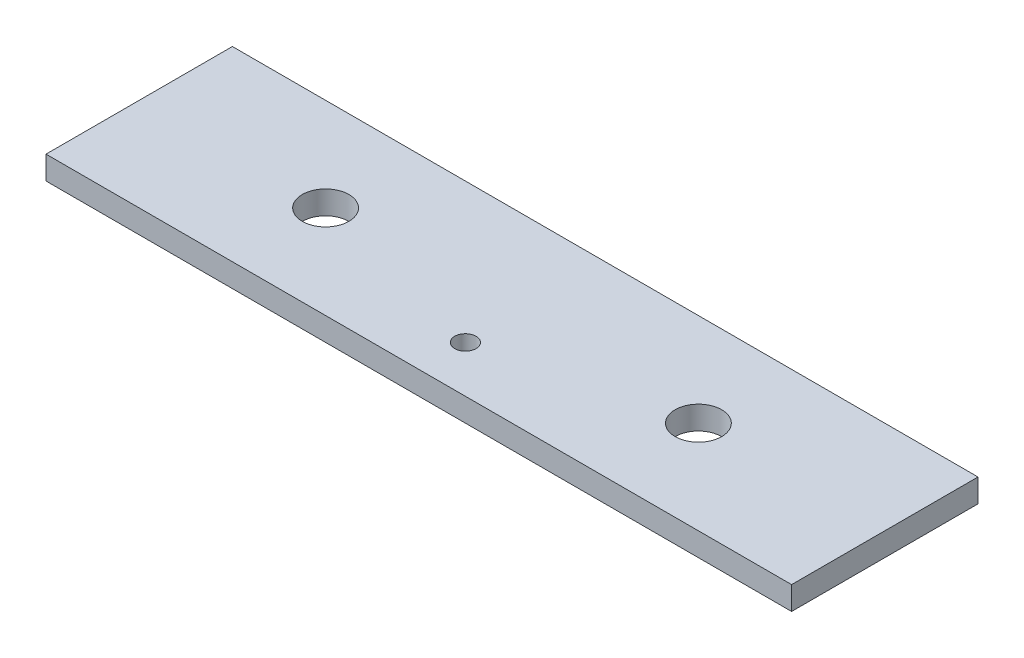
ISO-10303-21;
HEADER;
FILE_DESCRIPTION(('STEP AP214'),'2;1');
FILE_NAME('part.step','',(''),(''),'','','');
FILE_SCHEMA(('AUTOMOTIVE_DESIGN { 1 0 10303 214 1 1 1 1 }'));
ENDSEC;
DATA;
#1=APPLICATION_CONTEXT('core data for automotive mechanical design processes');
#2=APPLICATION_PROTOCOL_DEFINITION('international standard','automotive_design',2000,#1);
#3=PRODUCT_CONTEXT('',#1,'mechanical');
#4=PRODUCT('Part','Part','',(#3));
#5=PRODUCT_RELATED_PRODUCT_CATEGORY('part','',(#4));
#6=PRODUCT_DEFINITION_FORMATION('','',#4);
#7=PRODUCT_DEFINITION_CONTEXT('part definition',#1,'design');
#8=PRODUCT_DEFINITION('design','',#6,#7);
#9=PRODUCT_DEFINITION_SHAPE('','',#8);
#10=(LENGTH_UNIT() NAMED_UNIT(*) SI_UNIT(.MILLI.,.METRE.));
#11=(NAMED_UNIT(*) PLANE_ANGLE_UNIT() SI_UNIT($,.RADIAN.));
#12=(NAMED_UNIT(*) SI_UNIT($,.STERADIAN.) SOLID_ANGLE_UNIT());
#13=UNCERTAINTY_MEASURE_WITH_UNIT(LENGTH_MEASURE(1.E-05),#10,'distance_accuracy_value','');
#14=(GEOMETRIC_REPRESENTATION_CONTEXT(3) GLOBAL_UNCERTAINTY_ASSIGNED_CONTEXT((#13)) GLOBAL_UNIT_ASSIGNED_CONTEXT((#10,
#11,#12)) REPRESENTATION_CONTEXT('',''));
#15=CARTESIAN_POINT('',(0.,0.,0.));
#16=DIRECTION('',(0.,0.,1.));
#17=DIRECTION('',(1.,0.,0.));
#18=AXIS2_PLACEMENT_3D('',#15,#16,#17);
#19=CARTESIAN_POINT('',(0.,3.175,0.));
#20=DIRECTION('',(1.,0.,0.));
#21=DIRECTION('',(0.,0.,-1.));
#22=AXIS2_PLACEMENT_3D('',#19,#20,#21);
#23=PLANE('',#22);
#24=DIRECTION('',(0.,0.,1.));
#25=VECTOR('',#24,1.);
#26=CARTESIAN_POINT('',(0.,0.,0.));
#27=LINE('',#26,#25);
#28=CARTESIAN_POINT('',(0.,0.,-25.4));
#29=VERTEX_POINT('',#28);
#30=CARTESIAN_POINT('',(0.,0.,0.));
#31=VERTEX_POINT('',#30);
#32=EDGE_CURVE('E102',#29,#31,#27,.T.);
#33=ORIENTED_EDGE('',*,*,#32,.T.);
#34=DIRECTION('',(0.,-1.,0.));
#35=VECTOR('',#34,1.);
#36=CARTESIAN_POINT('',(0.,3.175,0.));
#37=LINE('',#36,#35);
#38=CARTESIAN_POINT('',(0.,3.175,0.));
#39=VERTEX_POINT('',#38);
#40=EDGE_CURVE('E11',#39,#31,#37,.T.);
#41=ORIENTED_EDGE('',*,*,#40,.F.);
#42=DIRECTION('',(0.,0.,1.));
#43=VECTOR('',#42,1.);
#44=CARTESIAN_POINT('',(0.,3.175,0.));
#45=LINE('',#44,#43);
#46=CARTESIAN_POINT('',(0.,3.175,-25.4));
#47=VERTEX_POINT('',#46);
#48=EDGE_CURVE('E90',#47,#39,#45,.T.);
#49=ORIENTED_EDGE('',*,*,#48,.F.);
#50=DIRECTION('',(0.,-1.,0.));
#51=VECTOR('',#50,1.);
#52=CARTESIAN_POINT('',(0.,3.175,-25.4));
#53=LINE('',#52,#51);
#54=EDGE_CURVE('E98',#47,#29,#53,.T.);
#55=ORIENTED_EDGE('',*,*,#54,.T.);
#56=EDGE_LOOP('',(#33,#41,#49,#55));
#57=FACE_BOUND('',#56,.T.);
#58=ADVANCED_FACE('F39',(#57),#23,.F.);
#59=CARTESIAN_POINT('',(0.,3.175,0.));
#60=DIRECTION('',(0.,0.,-1.));
#61=DIRECTION('',(-1.,0.,0.));
#62=AXIS2_PLACEMENT_3D('',#59,#60,#61);
#63=PLANE('',#62);
#64=DIRECTION('',(1.,0.,0.));
#65=VECTOR('',#64,1.);
#66=CARTESIAN_POINT('',(0.,0.,0.));
#67=LINE('',#66,#65);
#68=CARTESIAN_POINT('',(101.6,0.,0.));
#69=VERTEX_POINT('',#68);
#70=EDGE_CURVE('E94',#31,#69,#67,.T.);
#71=ORIENTED_EDGE('',*,*,#70,.T.);
#72=DIRECTION('',(0.,-1.,0.));
#73=VECTOR('',#72,1.);
#74=CARTESIAN_POINT('',(101.6,3.175,0.));
#75=LINE('',#74,#73);
#76=CARTESIAN_POINT('',(101.6,3.175,0.));
#77=VERTEX_POINT('',#76);
#78=EDGE_CURVE('E47',#77,#69,#75,.T.);
#79=ORIENTED_EDGE('',*,*,#78,.F.);
#80=DIRECTION('',(1.,0.,0.));
#81=VECTOR('',#80,1.);
#82=CARTESIAN_POINT('',(0.,3.175,0.));
#83=LINE('',#82,#81);
#84=EDGE_CURVE('E85',#39,#77,#83,.T.);
#85=ORIENTED_EDGE('',*,*,#84,.F.);
#86=ORIENTED_EDGE('',*,*,#40,.T.);
#87=EDGE_LOOP('',(#71,#79,#85,#86));
#88=FACE_BOUND('',#87,.T.);
#89=ADVANCED_FACE('F93',(#88),#63,.F.);
#90=CARTESIAN_POINT('',(101.6,3.175,0.));
#91=DIRECTION('',(-1.,0.,0.));
#92=DIRECTION('',(0.,0.,1.));
#93=AXIS2_PLACEMENT_3D('',#90,#91,#92);
#94=PLANE('',#93);
#95=DIRECTION('',(0.,0.,-1.));
#96=VECTOR('',#95,1.);
#97=CARTESIAN_POINT('',(101.6,0.,0.));
#98=LINE('',#97,#96);
#99=CARTESIAN_POINT('',(101.6,0.,-25.4));
#100=VERTEX_POINT('',#99);
#101=EDGE_CURVE('E72',#69,#100,#98,.T.);
#102=ORIENTED_EDGE('',*,*,#101,.T.);
#103=DIRECTION('',(0.,-1.,0.));
#104=VECTOR('',#103,1.);
#105=CARTESIAN_POINT('',(101.6,3.175,-25.4));
#106=LINE('',#105,#104);
#107=CARTESIAN_POINT('',(101.6,3.175,-25.4));
#108=VERTEX_POINT('',#107);
#109=EDGE_CURVE('E95',#108,#100,#106,.T.);
#110=ORIENTED_EDGE('',*,*,#109,.F.);
#111=DIRECTION('',(0.,0.,-1.));
#112=VECTOR('',#111,1.);
#113=CARTESIAN_POINT('',(101.6,3.175,0.));
#114=LINE('',#113,#112);
#115=EDGE_CURVE('E88',#77,#108,#114,.T.);
#116=ORIENTED_EDGE('',*,*,#115,.F.);
#117=ORIENTED_EDGE('',*,*,#78,.T.);
#118=EDGE_LOOP('',(#102,#110,#116,#117));
#119=FACE_BOUND('',#118,.T.);
#120=ADVANCED_FACE('F96',(#119),#94,.F.);
#121=CARTESIAN_POINT('',(0.,3.175,-25.4));
#122=DIRECTION('',(0.,0.,1.));
#123=DIRECTION('',(1.,0.,0.));
#124=AXIS2_PLACEMENT_3D('',#121,#122,#123);
#125=PLANE('',#124);
#126=DIRECTION('',(-1.,0.,0.));
#127=VECTOR('',#126,1.);
#128=CARTESIAN_POINT('',(0.,0.,-25.4));
#129=LINE('',#128,#127);
#130=EDGE_CURVE('E78',#100,#29,#129,.T.);
#131=ORIENTED_EDGE('',*,*,#130,.T.);
#132=ORIENTED_EDGE('',*,*,#54,.F.);
#133=DIRECTION('',(-1.,0.,0.));
#134=VECTOR('',#133,1.);
#135=CARTESIAN_POINT('',(0.,3.175,-25.4));
#136=LINE('',#135,#134);
#137=EDGE_CURVE('E55',#108,#47,#136,.T.);
#138=ORIENTED_EDGE('',*,*,#137,.F.);
#139=ORIENTED_EDGE('',*,*,#109,.T.);
#140=EDGE_LOOP('',(#131,#132,#138,#139));
#141=FACE_BOUND('',#140,.T.);
#142=ADVANCED_FACE('F110',(#141),#125,.F.);
#143=CARTESIAN_POINT('',(0.,3.175,0.));
#144=DIRECTION('',(0.,-1.,0.));
#145=DIRECTION('',(0.,0.,-1.));
#146=AXIS2_PLACEMENT_3D('',#143,#144,#145);
#147=PLANE('',#146);
#148=CARTESIAN_POINT('',(50.8,3.175,-6.35));
#149=DIRECTION('',(0.,1.,0.));
#150=DIRECTION('',(0.,0.,1.));
#151=AXIS2_PLACEMENT_3D('',#148,#149,#150);
#152=CIRCLE('',#151,1.4605);
#153=CARTESIAN_POINT('',(50.8,3.175,-4.8895));
#154=VERTEX_POINT('',#153);
#155=EDGE_CURVE('E128',#154,#154,#152,.T.);
#156=ORIENTED_EDGE('',*,*,#155,.F.);
#157=EDGE_LOOP('',(#156));
#158=FACE_BOUND('',#157,.T.);
#159=CARTESIAN_POINT('',(25.4,3.175,-12.7));
#160=DIRECTION('',(0.,1.,0.));
#161=DIRECTION('',(0.,0.,1.));
#162=AXIS2_PLACEMENT_3D('',#159,#160,#161);
#163=CIRCLE('',#162,3.175);
#164=CARTESIAN_POINT('',(25.4,3.175,-9.525));
#165=VERTEX_POINT('',#164);
#166=EDGE_CURVE('E125',#165,#165,#163,.T.);
#167=ORIENTED_EDGE('',*,*,#166,.F.);
#168=EDGE_LOOP('',(#167));
#169=FACE_BOUND('',#168,.T.);
#170=CARTESIAN_POINT('',(76.2,3.175,-12.7));
#171=DIRECTION('',(0.,1.,0.));
#172=DIRECTION('',(0.,0.,1.));
#173=AXIS2_PLACEMENT_3D('',#170,#171,#172);
#174=CIRCLE('',#173,3.175);
#175=CARTESIAN_POINT('',(76.2,3.175,-9.525));
#176=VERTEX_POINT('',#175);
#177=EDGE_CURVE('E119',#176,#176,#174,.T.);
#178=ORIENTED_EDGE('',*,*,#177,.F.);
#179=EDGE_LOOP('',(#178));
#180=FACE_BOUND('',#179,.T.);
#181=ORIENTED_EDGE('',*,*,#48,.T.);
#182=ORIENTED_EDGE('',*,*,#84,.T.);
#183=ORIENTED_EDGE('',*,*,#115,.T.);
#184=ORIENTED_EDGE('',*,*,#137,.T.);
#185=EDGE_LOOP('',(#181,#182,#183,#184));
#186=FACE_BOUND('',#185,.T.);
#187=ADVANCED_FACE('F86',(#158,#169,#180,#186),#147,.F.);
#188=CARTESIAN_POINT('',(0.,0.,0.));
#189=DIRECTION('',(0.,-1.,0.));
#190=DIRECTION('',(0.,0.,-1.));
#191=AXIS2_PLACEMENT_3D('',#188,#189,#190);
#192=PLANE('',#191);
#193=CARTESIAN_POINT('',(50.8,0.,-6.35));
#194=DIRECTION('',(0.,1.,0.));
#195=DIRECTION('',(0.,0.,1.));
#196=AXIS2_PLACEMENT_3D('',#193,#194,#195);
#197=CIRCLE('',#196,1.4605);
#198=CARTESIAN_POINT('',(50.8,0.,-4.8895));
#199=VERTEX_POINT('',#198);
#200=EDGE_CURVE('E105',#199,#199,#197,.T.);
#201=ORIENTED_EDGE('',*,*,#200,.T.);
#202=EDGE_LOOP('',(#201));
#203=FACE_BOUND('',#202,.T.);
#204=CARTESIAN_POINT('',(25.4,0.,-12.7));
#205=DIRECTION('',(0.,1.,0.));
#206=DIRECTION('',(0.,0.,1.));
#207=AXIS2_PLACEMENT_3D('',#204,#205,#206);
#208=CIRCLE('',#207,3.175);
#209=CARTESIAN_POINT('',(25.4,0.,-9.525));
#210=VERTEX_POINT('',#209);
#211=EDGE_CURVE('E122',#210,#210,#208,.T.);
#212=ORIENTED_EDGE('',*,*,#211,.T.);
#213=EDGE_LOOP('',(#212));
#214=FACE_BOUND('',#213,.T.);
#215=CARTESIAN_POINT('',(76.2,0.,-12.7));
#216=DIRECTION('',(0.,1.,0.));
#217=DIRECTION('',(0.,0.,1.));
#218=AXIS2_PLACEMENT_3D('',#215,#216,#217);
#219=CIRCLE('',#218,3.175);
#220=CARTESIAN_POINT('',(76.2,0.,-9.525));
#221=VERTEX_POINT('',#220);
#222=EDGE_CURVE('E116',#221,#221,#219,.T.);
#223=ORIENTED_EDGE('',*,*,#222,.T.);
#224=EDGE_LOOP('',(#223));
#225=FACE_BOUND('',#224,.T.);
#226=ORIENTED_EDGE('',*,*,#32,.F.);
#227=ORIENTED_EDGE('',*,*,#130,.F.);
#228=ORIENTED_EDGE('',*,*,#101,.F.);
#229=ORIENTED_EDGE('',*,*,#70,.F.);
#230=EDGE_LOOP('',(#226,#227,#228,#229));
#231=FACE_BOUND('',#230,.T.);
#232=ADVANCED_FACE('F113',(#203,#214,#225,#231),#192,.T.);
#233=CARTESIAN_POINT('',(76.2,0.,-12.7));
#234=DIRECTION('',(0.,1.,0.));
#235=DIRECTION('',(0.,0.,1.));
#236=AXIS2_PLACEMENT_3D('',#233,#234,#235);
#237=CYLINDRICAL_SURFACE('',#236,3.175);
#238=ORIENTED_EDGE('',*,*,#222,.F.);
#239=EDGE_LOOP('',(#238));
#240=FACE_BOUND('',#239,.T.);
#241=ORIENTED_EDGE('',*,*,#177,.T.);
#242=EDGE_LOOP('',(#241));
#243=FACE_BOUND('',#242,.T.);
#244=ADVANCED_FACE('F150',(#240,#243),#237,.F.);
#245=CARTESIAN_POINT('',(25.4,0.,-12.7));
#246=DIRECTION('',(0.,1.,0.));
#247=DIRECTION('',(0.,0.,1.));
#248=AXIS2_PLACEMENT_3D('',#245,#246,#247);
#249=CYLINDRICAL_SURFACE('',#248,3.175);
#250=ORIENTED_EDGE('',*,*,#211,.F.);
#251=EDGE_LOOP('',(#250));
#252=FACE_BOUND('',#251,.T.);
#253=ORIENTED_EDGE('',*,*,#166,.T.);
#254=EDGE_LOOP('',(#253));
#255=FACE_BOUND('',#254,.T.);
#256=ADVANCED_FACE('F139',(#252,#255),#249,.F.);
#257=CARTESIAN_POINT('',(50.8,0.,-6.35));
#258=DIRECTION('',(0.,1.,0.));
#259=DIRECTION('',(0.,0.,1.));
#260=AXIS2_PLACEMENT_3D('',#257,#258,#259);
#261=CYLINDRICAL_SURFACE('',#260,1.4605);
#262=ORIENTED_EDGE('',*,*,#200,.F.);
#263=EDGE_LOOP('',(#262));
#264=FACE_BOUND('',#263,.T.);
#265=ORIENTED_EDGE('',*,*,#155,.T.);
#266=EDGE_LOOP('',(#265));
#267=FACE_BOUND('',#266,.T.);
#268=ADVANCED_FACE('F136',(#264,#267),#261,.F.);
#269=CLOSED_SHELL('',(#58,#89,#120,#142,#187,#232,#244,#256,#268));
#270=MANIFOLD_SOLID_BREP('B2',#269);
#271=ADVANCED_BREP_SHAPE_REPRESENTATION('',(#18,#270),#14);
#272=SHAPE_DEFINITION_REPRESENTATION(#9,#271);
ENDSEC;
END-ISO-10303-21;
